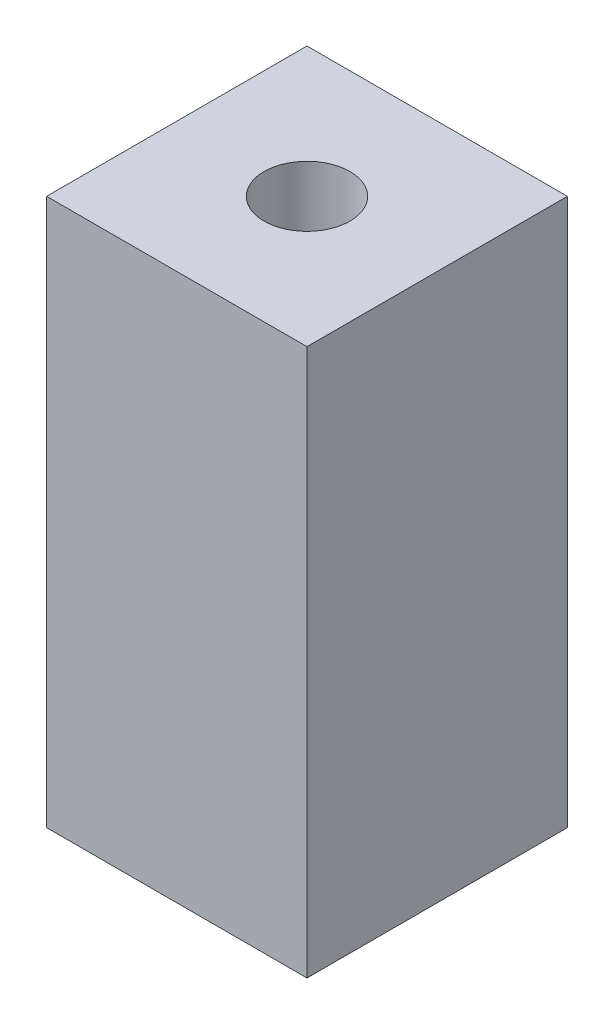
ISO-10303-21;
HEADER;
FILE_DESCRIPTION(('STEP AP214'),'2;1');
FILE_NAME('part.step','',(''),(''),'','','');
FILE_SCHEMA(('AUTOMOTIVE_DESIGN { 1 0 10303 214 1 1 1 1 }'));
ENDSEC;
DATA;
#1=APPLICATION_CONTEXT('core data for automotive mechanical design processes');
#2=APPLICATION_PROTOCOL_DEFINITION('international standard','automotive_design',2000,#1);
#3=PRODUCT_CONTEXT('',#1,'mechanical');
#4=PRODUCT('Part','Part','',(#3));
#5=PRODUCT_RELATED_PRODUCT_CATEGORY('part','',(#4));
#6=PRODUCT_DEFINITION_FORMATION('','',#4);
#7=PRODUCT_DEFINITION_CONTEXT('part definition',#1,'design');
#8=PRODUCT_DEFINITION('design','',#6,#7);
#9=PRODUCT_DEFINITION_SHAPE('','',#8);
#10=(LENGTH_UNIT() NAMED_UNIT(*) SI_UNIT(.MILLI.,.METRE.));
#11=(NAMED_UNIT(*) PLANE_ANGLE_UNIT() SI_UNIT($,.RADIAN.));
#12=(NAMED_UNIT(*) SI_UNIT($,.STERADIAN.) SOLID_ANGLE_UNIT());
#13=UNCERTAINTY_MEASURE_WITH_UNIT(LENGTH_MEASURE(1.E-05),#10,'distance_accuracy_value','');
#14=(GEOMETRIC_REPRESENTATION_CONTEXT(3) GLOBAL_UNCERTAINTY_ASSIGNED_CONTEXT((#13)) GLOBAL_UNIT_ASSIGNED_CONTEXT((#10,
#11,#12)) REPRESENTATION_CONTEXT('',''));
#15=CARTESIAN_POINT('',(0.,0.,0.));
#16=DIRECTION('',(0.,0.,1.));
#17=DIRECTION('',(1.,0.,0.));
#18=AXIS2_PLACEMENT_3D('',#15,#16,#17);
#19=CARTESIAN_POINT('',(0.,10.5,0.));
#20=DIRECTION('',(0.,1.,0.));
#21=DIRECTION('',(0.,0.,1.));
#22=AXIS2_PLACEMENT_3D('',#19,#20,#21);
#23=PLANE('',#22);
#24=DIRECTION('',(0.,0.,-1.));
#25=VECTOR('',#24,1.);
#26=CARTESIAN_POINT('',(2.5,10.5,-2.5));
#27=LINE('',#26,#25);
#28=CARTESIAN_POINT('',(2.5,10.5,2.5));
#29=VERTEX_POINT('',#28);
#30=CARTESIAN_POINT('',(2.5,10.5,-2.5));
#31=VERTEX_POINT('',#30);
#32=EDGE_CURVE('E87',#29,#31,#27,.T.);
#33=ORIENTED_EDGE('',*,*,#32,.T.);
#34=DIRECTION('',(-1.,0.,0.));
#35=VECTOR('',#34,1.);
#36=CARTESIAN_POINT('',(-2.5,10.5,-2.5));
#37=LINE('',#36,#35);
#38=CARTESIAN_POINT('',(-2.5,10.5,-2.5));
#39=VERTEX_POINT('',#38);
#40=EDGE_CURVE('E82',#31,#39,#37,.T.);
#41=ORIENTED_EDGE('',*,*,#40,.T.);
#42=DIRECTION('',(0.,0.,1.));
#43=VECTOR('',#42,1.);
#44=CARTESIAN_POINT('',(-2.5,10.5,-2.5));
#45=LINE('',#44,#43);
#46=CARTESIAN_POINT('',(-2.5,10.5,2.5));
#47=VERTEX_POINT('',#46);
#48=EDGE_CURVE('E85',#39,#47,#45,.T.);
#49=ORIENTED_EDGE('',*,*,#48,.T.);
#50=DIRECTION('',(1.,0.,0.));
#51=VECTOR('',#50,1.);
#52=CARTESIAN_POINT('',(-2.5,10.5,2.5));
#53=LINE('',#52,#51);
#54=EDGE_CURVE('E52',#47,#29,#53,.T.);
#55=ORIENTED_EDGE('',*,*,#54,.T.);
#56=EDGE_LOOP('',(#33,#41,#49,#55));
#57=FACE_BOUND('',#56,.T.);
#58=CARTESIAN_POINT('',(0.,10.5,0.));
#59=DIRECTION('',(0.,1.,0.));
#60=DIRECTION('',(0.,0.,1.));
#61=AXIS2_PLACEMENT_3D('',#58,#59,#60);
#62=CIRCLE('',#61,0.825);
#63=CARTESIAN_POINT('',(0.,10.5,-0.825));
#64=VERTEX_POINT('',#63);
#65=EDGE_CURVE('E102',#64,#64,#62,.T.);
#66=ORIENTED_EDGE('',*,*,#65,.F.);
#67=EDGE_LOOP('',(#66));
#68=FACE_BOUND('',#67,.T.);
#69=ADVANCED_FACE('F35',(#57,#68),#23,.T.);
#70=CARTESIAN_POINT('',(0.,0.,0.));
#71=DIRECTION('',(0.,1.,0.));
#72=DIRECTION('',(0.,0.,1.));
#73=AXIS2_PLACEMENT_3D('',#70,#71,#72);
#74=PLANE('',#73);
#75=DIRECTION('',(0.,0.,-1.));
#76=VECTOR('',#75,1.);
#77=CARTESIAN_POINT('',(2.5,0.,-2.5));
#78=LINE('',#77,#76);
#79=CARTESIAN_POINT('',(2.5,0.,2.5));
#80=VERTEX_POINT('',#79);
#81=CARTESIAN_POINT('',(2.5,0.,-2.5));
#82=VERTEX_POINT('',#81);
#83=EDGE_CURVE('E99',#80,#82,#78,.T.);
#84=ORIENTED_EDGE('',*,*,#83,.F.);
#85=DIRECTION('',(1.,0.,0.));
#86=VECTOR('',#85,1.);
#87=CARTESIAN_POINT('',(-2.5,0.,2.5));
#88=LINE('',#87,#86);
#89=CARTESIAN_POINT('',(-2.5,0.,2.5));
#90=VERTEX_POINT('',#89);
#91=EDGE_CURVE('E75',#90,#80,#88,.T.);
#92=ORIENTED_EDGE('',*,*,#91,.F.);
#93=DIRECTION('',(0.,0.,1.));
#94=VECTOR('',#93,1.);
#95=CARTESIAN_POINT('',(-2.5,0.,-2.5));
#96=LINE('',#95,#94);
#97=CARTESIAN_POINT('',(-2.5,0.,-2.5));
#98=VERTEX_POINT('',#97);
#99=EDGE_CURVE('E69',#98,#90,#96,.T.);
#100=ORIENTED_EDGE('',*,*,#99,.F.);
#101=DIRECTION('',(-1.,0.,0.));
#102=VECTOR('',#101,1.);
#103=CARTESIAN_POINT('',(-2.5,0.,-2.5));
#104=LINE('',#103,#102);
#105=EDGE_CURVE('E91',#82,#98,#104,.T.);
#106=ORIENTED_EDGE('',*,*,#105,.F.);
#107=EDGE_LOOP('',(#84,#92,#100,#106));
#108=FACE_BOUND('',#107,.T.);
#109=CARTESIAN_POINT('',(0.,0.,0.));
#110=DIRECTION('',(0.,1.,0.));
#111=DIRECTION('',(0.,0.,1.));
#112=AXIS2_PLACEMENT_3D('',#109,#110,#111);
#113=CIRCLE('',#112,0.825);
#114=CARTESIAN_POINT('',(0.,0.,-0.825));
#115=VERTEX_POINT('',#114);
#116=EDGE_CURVE('E114',#115,#115,#113,.T.);
#117=ORIENTED_EDGE('',*,*,#116,.T.);
#118=EDGE_LOOP('',(#117));
#119=FACE_BOUND('',#118,.T.);
#120=ADVANCED_FACE('F110',(#108,#119),#74,.F.);
#121=CARTESIAN_POINT('',(2.5,10.5,-2.5));
#122=DIRECTION('',(-1.,0.,0.));
#123=DIRECTION('',(0.,0.,1.));
#124=AXIS2_PLACEMENT_3D('',#121,#122,#123);
#125=PLANE('',#124);
#126=ORIENTED_EDGE('',*,*,#83,.T.);
#127=DIRECTION('',(0.,-1.,0.));
#128=VECTOR('',#127,1.);
#129=CARTESIAN_POINT('',(2.5,10.5,-2.5));
#130=LINE('',#129,#128);
#131=EDGE_CURVE('E11',#31,#82,#130,.T.);
#132=ORIENTED_EDGE('',*,*,#131,.F.);
#133=ORIENTED_EDGE('',*,*,#32,.F.);
#134=DIRECTION('',(0.,-1.,0.));
#135=VECTOR('',#134,1.);
#136=CARTESIAN_POINT('',(2.5,10.5,2.5));
#137=LINE('',#136,#135);
#138=EDGE_CURVE('E95',#29,#80,#137,.T.);
#139=ORIENTED_EDGE('',*,*,#138,.T.);
#140=EDGE_LOOP('',(#126,#132,#133,#139));
#141=FACE_BOUND('',#140,.T.);
#142=ADVANCED_FACE('F37',(#141),#125,.F.);
#143=CARTESIAN_POINT('',(-2.5,10.5,-2.5));
#144=DIRECTION('',(0.,0.,1.));
#145=DIRECTION('',(1.,0.,0.));
#146=AXIS2_PLACEMENT_3D('',#143,#144,#145);
#147=PLANE('',#146);
#148=ORIENTED_EDGE('',*,*,#105,.T.);
#149=DIRECTION('',(0.,-1.,0.));
#150=VECTOR('',#149,1.);
#151=CARTESIAN_POINT('',(-2.5,10.5,-2.5));
#152=LINE('',#151,#150);
#153=EDGE_CURVE('E44',#39,#98,#152,.T.);
#154=ORIENTED_EDGE('',*,*,#153,.F.);
#155=ORIENTED_EDGE('',*,*,#40,.F.);
#156=ORIENTED_EDGE('',*,*,#131,.T.);
#157=EDGE_LOOP('',(#148,#154,#155,#156));
#158=FACE_BOUND('',#157,.T.);
#159=ADVANCED_FACE('F90',(#158),#147,.F.);
#160=CARTESIAN_POINT('',(-2.5,10.5,-2.5));
#161=DIRECTION('',(1.,0.,0.));
#162=DIRECTION('',(0.,0.,-1.));
#163=AXIS2_PLACEMENT_3D('',#160,#161,#162);
#164=PLANE('',#163);
#165=ORIENTED_EDGE('',*,*,#99,.T.);
#166=DIRECTION('',(0.,-1.,0.));
#167=VECTOR('',#166,1.);
#168=CARTESIAN_POINT('',(-2.5,10.5,2.5));
#169=LINE('',#168,#167);
#170=EDGE_CURVE('E92',#47,#90,#169,.T.);
#171=ORIENTED_EDGE('',*,*,#170,.F.);
#172=ORIENTED_EDGE('',*,*,#48,.F.);
#173=ORIENTED_EDGE('',*,*,#153,.T.);
#174=EDGE_LOOP('',(#165,#171,#172,#173));
#175=FACE_BOUND('',#174,.T.);
#176=ADVANCED_FACE('F93',(#175),#164,.F.);
#177=CARTESIAN_POINT('',(-2.5,10.5,2.5));
#178=DIRECTION('',(0.,0.,-1.));
#179=DIRECTION('',(-1.,0.,0.));
#180=AXIS2_PLACEMENT_3D('',#177,#178,#179);
#181=PLANE('',#180);
#182=ORIENTED_EDGE('',*,*,#91,.T.);
#183=ORIENTED_EDGE('',*,*,#138,.F.);
#184=ORIENTED_EDGE('',*,*,#54,.F.);
#185=ORIENTED_EDGE('',*,*,#170,.T.);
#186=EDGE_LOOP('',(#182,#183,#184,#185));
#187=FACE_BOUND('',#186,.T.);
#188=ADVANCED_FACE('F107',(#187),#181,.F.);
#189=CARTESIAN_POINT('',(0.,10.5,0.));
#190=DIRECTION('',(0.,-1.,0.));
#191=DIRECTION('',(0.,0.,-1.));
#192=AXIS2_PLACEMENT_3D('',#189,#190,#191);
#193=CYLINDRICAL_SURFACE('',#192,0.825);
#194=CARTESIAN_POINT('',(0.,10.5,-0.825));
#195=CARTESIAN_POINT('',(0.,10.390625,-0.825));
#196=CARTESIAN_POINT('',(0.,10.28125,-0.825));
#197=CARTESIAN_POINT('',(0.,10.0625,-0.825));
#198=CARTESIAN_POINT('',(0.,9.953125,-0.825));
#199=CARTESIAN_POINT('',(0.,9.734375,-0.825));
#200=CARTESIAN_POINT('',(0.,9.625,-0.825));
#201=CARTESIAN_POINT('',(0.,9.40625,-0.825));
#202=CARTESIAN_POINT('',(0.,9.296875,-0.825));
#203=CARTESIAN_POINT('',(0.,9.078125,-0.825));
#204=CARTESIAN_POINT('',(0.,8.96875,-0.825));
#205=CARTESIAN_POINT('',(0.,8.75,-0.825));
#206=CARTESIAN_POINT('',(0.,8.640625,-0.825));
#207=CARTESIAN_POINT('',(0.,8.421875,-0.825));
#208=CARTESIAN_POINT('',(0.,8.3125,-0.825));
#209=CARTESIAN_POINT('',(0.,8.09375,-0.825));
#210=CARTESIAN_POINT('',(0.,7.984375,-0.825));
#211=CARTESIAN_POINT('',(0.,7.765625,-0.825));
#212=CARTESIAN_POINT('',(0.,7.65625,-0.825));
#213=CARTESIAN_POINT('',(0.,7.4375,-0.825));
#214=CARTESIAN_POINT('',(0.,7.328125,-0.825));
#215=CARTESIAN_POINT('',(0.,7.109375,-0.825));
#216=CARTESIAN_POINT('',(0.,7.,-0.825));
#217=CARTESIAN_POINT('',(0.,6.78125,-0.825));
#218=CARTESIAN_POINT('',(0.,6.671875,-0.825));
#219=CARTESIAN_POINT('',(0.,6.453125,-0.825));
#220=CARTESIAN_POINT('',(0.,6.34375,-0.825));
#221=CARTESIAN_POINT('',(0.,6.125,-0.825));
#222=CARTESIAN_POINT('',(0.,6.015625,-0.825));
#223=CARTESIAN_POINT('',(0.,5.796875,-0.825));
#224=CARTESIAN_POINT('',(0.,5.6875,-0.825));
#225=CARTESIAN_POINT('',(0.,5.46875,-0.825));
#226=CARTESIAN_POINT('',(0.,5.359375,-0.825));
#227=CARTESIAN_POINT('',(0.,5.140625,-0.825));
#228=CARTESIAN_POINT('',(0.,5.03125,-0.825));
#229=CARTESIAN_POINT('',(0.,4.8125,-0.825));
#230=CARTESIAN_POINT('',(0.,4.703125,-0.825));
#231=CARTESIAN_POINT('',(0.,4.484375,-0.825));
#232=CARTESIAN_POINT('',(0.,4.375,-0.825));
#233=CARTESIAN_POINT('',(0.,4.15625,-0.825));
#234=CARTESIAN_POINT('',(0.,4.046875,-0.825));
#235=CARTESIAN_POINT('',(0.,3.828125,-0.825));
#236=CARTESIAN_POINT('',(0.,3.71875,-0.825));
#237=CARTESIAN_POINT('',(0.,3.5,-0.825));
#238=CARTESIAN_POINT('',(0.,3.390625,-0.825));
#239=CARTESIAN_POINT('',(0.,3.171875,-0.825));
#240=CARTESIAN_POINT('',(0.,3.0625,-0.825));
#241=CARTESIAN_POINT('',(0.,2.84375,-0.825));
#242=CARTESIAN_POINT('',(0.,2.734375,-0.825));
#243=CARTESIAN_POINT('',(0.,2.515625,-0.825));
#244=CARTESIAN_POINT('',(0.,2.40625,-0.825));
#245=CARTESIAN_POINT('',(0.,2.1875,-0.825));
#246=CARTESIAN_POINT('',(0.,2.078125,-0.825));
#247=CARTESIAN_POINT('',(0.,1.859375,-0.825));
#248=CARTESIAN_POINT('',(0.,1.75,-0.825));
#249=CARTESIAN_POINT('',(0.,1.53125,-0.825));
#250=CARTESIAN_POINT('',(0.,1.421875,-0.825));
#251=CARTESIAN_POINT('',(0.,1.203125,-0.825));
#252=CARTESIAN_POINT('',(0.,1.09375,-0.825));
#253=CARTESIAN_POINT('',(0.,0.875000000000001,-0.825));
#254=CARTESIAN_POINT('',(0.,0.765625000000001,-0.825));
#255=CARTESIAN_POINT('',(0.,0.546875,-0.825));
#256=CARTESIAN_POINT('',(0.,0.4375,-0.825));
#257=CARTESIAN_POINT('',(0.,0.21875,-0.825));
#258=CARTESIAN_POINT('',(0.,0.109375,-0.825));
#259=CARTESIAN_POINT('',(0.,0.,-0.825));
#260=B_SPLINE_CURVE_WITH_KNOTS('',3,(#194,#195,#196,#197,#198,#199,#200,#201,#202,#203,#204,
#205,#206,#207,#208,#209,#210,#211,#212,#213,#214,#215,#216,#217,#218,#219,#220,#221,#222,#223,
#224,#225,#226,#227,#228,#229,#230,#231,#232,#233,#234,#235,#236,#237,#238,#239,#240,#241,#242,
#243,#244,#245,#246,#247,#248,#249,#250,#251,#252,#253,#254,#255,#256,#257,#258,#259),
.UNSPECIFIED.,.F.,.F.,(4,2,2,2,2,2,2,2,2,2,2,2,2,2,2,2,2,2,2,2,2,2,2,2,2,2,2,2,2,2,2,2,4),(0.,
0.328124999999999,0.656249999999999,0.984374999999999,1.3125,1.640625,1.96875,2.296875,2.625,
2.953125,3.28125,3.609375,3.9375,4.265625,4.59375,4.921875,5.25,5.578125,5.90625,6.234375,
6.5625,6.890625,7.21875,7.546875,7.875,8.203125,8.53125,8.859375,9.1875,9.515625,9.84375,
10.171875,10.5),.UNSPECIFIED.);
#261=EDGE_CURVE('BSEAM120',#64,#115,#260,.T.);
#262=ORIENTED_EDGE('',*,*,#65,.T.);
#263=ORIENTED_EDGE('',*,*,#116,.F.);
#264=ORIENTED_EDGE('',*,*,#261,.T.);
#265=ORIENTED_EDGE('',*,*,#261,.F.);
#266=EDGE_LOOP('',(#262,#264,#263,#265));
#267=FACE_BOUND('',#266,.T.);
#268=ADVANCED_FACE('F120',(#267),#193,.F.);
#269=CLOSED_SHELL('',(#69,#120,#142,#159,#176,#188,#268));
#270=MANIFOLD_SOLID_BREP('B2',#269);
#271=ADVANCED_BREP_SHAPE_REPRESENTATION('',(#18,#270),#14);
#272=SHAPE_DEFINITION_REPRESENTATION(#9,#271);
ENDSEC;
END-ISO-10303-21;
